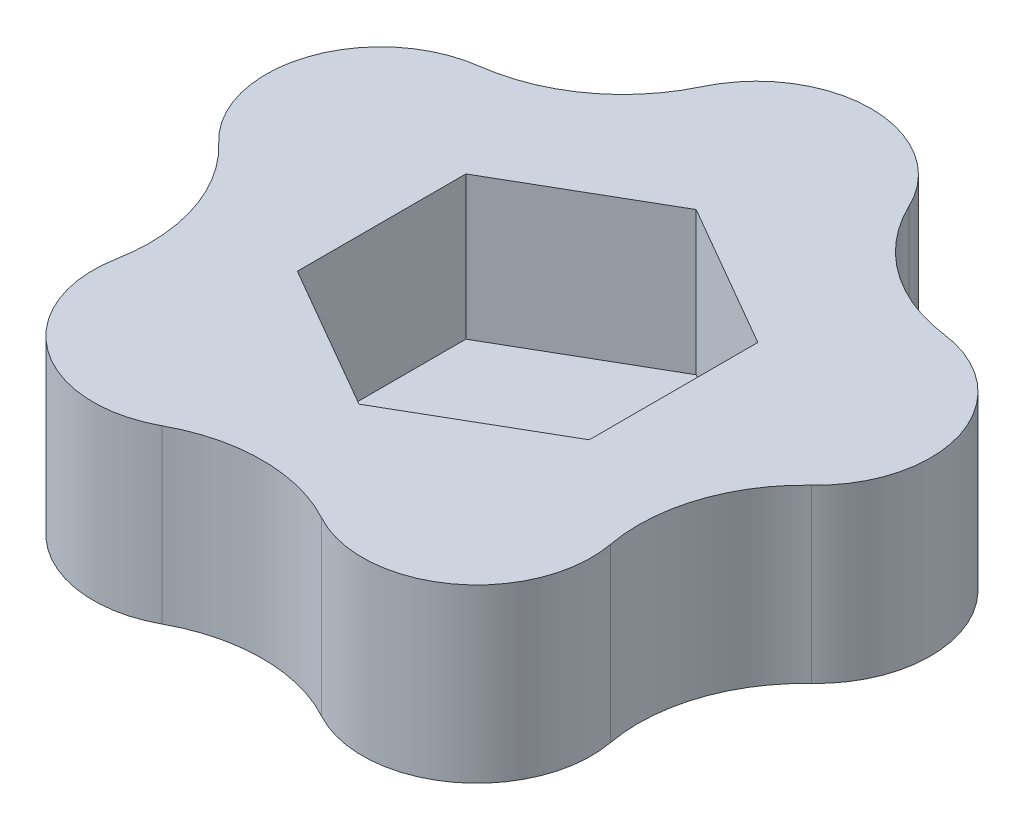
ISO-10303-21;
HEADER;
FILE_DESCRIPTION(('STEP AP214'),'2;1');
FILE_NAME('part.step','',(''),(''),'','','');
FILE_SCHEMA(('AUTOMOTIVE_DESIGN { 1 0 10303 214 1 1 1 1 }'));
ENDSEC;
DATA;
#1=APPLICATION_CONTEXT('core data for automotive mechanical design processes');
#2=APPLICATION_PROTOCOL_DEFINITION('international standard','automotive_design',2000,#1);
#3=PRODUCT_CONTEXT('',#1,'mechanical');
#4=PRODUCT('Part','Part','',(#3));
#5=PRODUCT_RELATED_PRODUCT_CATEGORY('part','',(#4));
#6=PRODUCT_DEFINITION_FORMATION('','',#4);
#7=PRODUCT_DEFINITION_CONTEXT('part definition',#1,'design');
#8=PRODUCT_DEFINITION('design','',#6,#7);
#9=PRODUCT_DEFINITION_SHAPE('','',#8);
#10=(LENGTH_UNIT() NAMED_UNIT(*) SI_UNIT(.MILLI.,.METRE.));
#11=(NAMED_UNIT(*) PLANE_ANGLE_UNIT() SI_UNIT($,.RADIAN.));
#12=(NAMED_UNIT(*) SI_UNIT($,.STERADIAN.) SOLID_ANGLE_UNIT());
#13=UNCERTAINTY_MEASURE_WITH_UNIT(LENGTH_MEASURE(1.E-05),#10,'distance_accuracy_value','');
#14=(GEOMETRIC_REPRESENTATION_CONTEXT(3) GLOBAL_UNCERTAINTY_ASSIGNED_CONTEXT((#13)) GLOBAL_UNIT_ASSIGNED_CONTEXT((#10,
#11,#12)) REPRESENTATION_CONTEXT('',''));
#15=CARTESIAN_POINT('',(0.,0.,0.));
#16=DIRECTION('',(0.,0.,1.));
#17=DIRECTION('',(1.,0.,0.));
#18=AXIS2_PLACEMENT_3D('',#15,#16,#17);
#19=CARTESIAN_POINT('',(8.86859858896919,6.,-12.2065787577734));
#20=DIRECTION('',(0.,-1.,0.));
#21=DIRECTION('',(0.,0.,-1.));
#22=AXIS2_PLACEMENT_3D('',#19,#20,#21);
#23=CYLINDRICAL_SURFACE('',#22,5.8156683816038);
#24=CARTESIAN_POINT('',(8.86859858896919,0.,-12.2065787577734));
#25=DIRECTION('',(0.,-1.,0.));
#26=DIRECTION('',(0.,0.,-1.));
#27=AXIS2_PLACEMENT_3D('',#24,#25,#26);
#28=CIRCLE('',#27,5.8156683816038);
#29=CARTESIAN_POINT('',(8.12197659333909,0.,-6.43903557887757));
#30=VERTEX_POINT('',#29);
#31=CARTESIAN_POINT('',(3.61405795069052,0.,-9.71423018554995));
#32=VERTEX_POINT('',#31);
#33=EDGE_CURVE('E155',#30,#32,#28,.T.);
#34=ORIENTED_EDGE('',*,*,#33,.T.);
#35=DIRECTION('',(0.,-1.,0.));
#36=VECTOR('',#35,1.);
#37=CARTESIAN_POINT('',(3.61405795069052,6.,-9.71423018554995));
#38=LINE('',#37,#36);
#39=CARTESIAN_POINT('',(3.61405795069052,6.,-9.71423018554995));
#40=VERTEX_POINT('',#39);
#41=EDGE_CURVE('E12',#40,#32,#38,.T.);
#42=ORIENTED_EDGE('',*,*,#41,.F.);
#43=CARTESIAN_POINT('',(8.86859858896919,6.,-12.2065787577734));
#44=DIRECTION('',(0.,-1.,0.));
#45=DIRECTION('',(0.,0.,-1.));
#46=AXIS2_PLACEMENT_3D('',#43,#44,#45);
#47=CIRCLE('',#46,5.8156683816038);
#48=CARTESIAN_POINT('',(8.12197659333909,6.,-6.43903557887757));
#49=VERTEX_POINT('',#48);
#50=EDGE_CURVE('E175',#49,#40,#47,.T.);
#51=ORIENTED_EDGE('',*,*,#50,.F.);
#52=DIRECTION('',(0.,-1.,0.));
#53=VECTOR('',#52,1.);
#54=CARTESIAN_POINT('',(8.12197659333909,6.,-6.43903557887757));
#55=LINE('',#54,#53);
#56=EDGE_CURVE('E151',#49,#30,#55,.T.);
#57=ORIENTED_EDGE('',*,*,#56,.T.);
#58=EDGE_LOOP('',(#34,#42,#51,#57));
#59=FACE_BOUND('',#58,.T.);
#60=ADVANCED_FACE('F35',(#59),#23,.F.);
#61=CARTESIAN_POINT('',(0.,6.,-8.));
#62=DIRECTION('',(0.,-1.,0.));
#63=DIRECTION('',(0.,0.,-1.));
#64=AXIS2_PLACEMENT_3D('',#61,#62,#63);
#65=CYLINDRICAL_SURFACE('',#64,4.);
#66=CARTESIAN_POINT('',(0.,0.,-8.));
#67=DIRECTION('',(0.,1.,0.));
#68=DIRECTION('',(0.,0.,-1.));
#69=AXIS2_PLACEMENT_3D('',#66,#67,#68);
#70=CIRCLE('',#69,4.);
#71=CARTESIAN_POINT('',(-3.61405795069052,0.,-9.71423018554995));
#72=VERTEX_POINT('',#71);
#73=EDGE_CURVE('E158',#32,#72,#70,.T.);
#74=ORIENTED_EDGE('',*,*,#73,.T.);
#75=DIRECTION('',(0.,-1.,0.));
#76=VECTOR('',#75,1.);
#77=CARTESIAN_POINT('',(-3.61405795069052,6.,-9.71423018554995));
#78=LINE('',#77,#76);
#79=CARTESIAN_POINT('',(-3.61405795069052,6.,-9.71423018554995));
#80=VERTEX_POINT('',#79);
#81=EDGE_CURVE('E42',#80,#72,#78,.T.);
#82=ORIENTED_EDGE('',*,*,#81,.F.);
#83=CARTESIAN_POINT('',(0.,6.,-8.));
#84=DIRECTION('',(0.,1.,0.));
#85=DIRECTION('',(0.,0.,-1.));
#86=AXIS2_PLACEMENT_3D('',#83,#84,#85);
#87=CIRCLE('',#86,4.);
#88=EDGE_CURVE('E105',#40,#80,#87,.T.);
#89=ORIENTED_EDGE('',*,*,#88,.F.);
#90=ORIENTED_EDGE('',*,*,#41,.T.);
#91=EDGE_LOOP('',(#74,#82,#89,#90));
#92=FACE_BOUND('',#91,.T.);
#93=ADVANCED_FACE('F327',(#92),#65,.T.);
#94=CARTESIAN_POINT('',(-8.86859858896919,6.,-12.2065787577734));
#95=DIRECTION('',(0.,-1.,0.));
#96=DIRECTION('',(0.,0.,-1.));
#97=AXIS2_PLACEMENT_3D('',#94,#95,#96);
#98=CYLINDRICAL_SURFACE('',#97,5.8156683816038);
#99=CARTESIAN_POINT('',(-8.86859858896919,0.,-12.2065787577734));
#100=DIRECTION('',(0.,-1.,0.));
#101=DIRECTION('',(0.,0.,-1.));
#102=AXIS2_PLACEMENT_3D('',#99,#100,#101);
#103=CIRCLE('',#102,5.8156683816038);
#104=CARTESIAN_POINT('',(-8.12197659333909,0.,-6.43903557887757));
#105=VERTEX_POINT('',#104);
#106=EDGE_CURVE('E161',#72,#105,#103,.T.);
#107=ORIENTED_EDGE('',*,*,#106,.T.);
#108=DIRECTION('',(0.,-1.,0.));
#109=VECTOR('',#108,1.);
#110=CARTESIAN_POINT('',(-8.12197659333909,6.,-6.43903557887757));
#111=LINE('',#110,#109);
#112=CARTESIAN_POINT('',(-8.12197659333909,6.,-6.43903557887757));
#113=VERTEX_POINT('',#112);
#114=EDGE_CURVE('E188',#113,#105,#111,.T.);
#115=ORIENTED_EDGE('',*,*,#114,.F.);
#116=CARTESIAN_POINT('',(-8.86859858896919,6.,-12.2065787577734));
#117=DIRECTION('',(0.,-1.,0.));
#118=DIRECTION('',(0.,0.,-1.));
#119=AXIS2_PLACEMENT_3D('',#116,#117,#118);
#120=CIRCLE('',#119,5.8156683816038);
#121=EDGE_CURVE('E196',#80,#113,#120,.T.);
#122=ORIENTED_EDGE('',*,*,#121,.F.);
#123=ORIENTED_EDGE('',*,*,#81,.T.);
#124=EDGE_LOOP('',(#107,#115,#122,#123));
#125=FACE_BOUND('',#124,.T.);
#126=ADVANCED_FACE('F194',(#125),#98,.F.);
#127=CARTESIAN_POINT('',(-7.60845213036123,6.,-2.47213595499958));
#128=DIRECTION('',(0.,-1.,0.));
#129=DIRECTION('',(0.,0.,-1.));
#130=AXIS2_PLACEMENT_3D('',#127,#128,#129);
#131=CYLINDRICAL_SURFACE('',#130,4.);
#132=CARTESIAN_POINT('',(-7.60845213036123,0.,-2.47213595499958));
#133=DIRECTION('',(0.,1.,0.));
#134=DIRECTION('',(0.,0.,-1.));
#135=AXIS2_PLACEMENT_3D('',#132,#133,#134);
#136=CIRCLE('',#135,4.);
#137=CARTESIAN_POINT('',(-10.3555872441776,0.,0.435311149667507));
#138=VERTEX_POINT('',#137);
#139=EDGE_CURVE('E163',#105,#138,#136,.T.);
#140=ORIENTED_EDGE('',*,*,#139,.T.);
#141=DIRECTION('',(0.,-1.,0.));
#142=VECTOR('',#141,1.);
#143=CARTESIAN_POINT('',(-10.3555872441776,6.,0.435311149667507));
#144=LINE('',#143,#142);
#145=CARTESIAN_POINT('',(-10.3555872441776,6.,0.435311149667507));
#146=VERTEX_POINT('',#145);
#147=EDGE_CURVE('E185',#146,#138,#144,.T.);
#148=ORIENTED_EDGE('',*,*,#147,.F.);
#149=CARTESIAN_POINT('',(-7.60845213036123,6.,-2.47213595499958));
#150=DIRECTION('',(0.,1.,0.));
#151=DIRECTION('',(0.,0.,-1.));
#152=AXIS2_PLACEMENT_3D('',#149,#150,#151);
#153=CIRCLE('',#152,4.);
#154=EDGE_CURVE('E214',#113,#146,#153,.T.);
#155=ORIENTED_EDGE('',*,*,#154,.F.);
#156=ORIENTED_EDGE('',*,*,#114,.T.);
#157=EDGE_LOOP('',(#140,#148,#155,#156));
#158=FACE_BOUND('',#157,.T.);
#159=ADVANCED_FACE('F205',(#158),#131,.T.);
#160=CARTESIAN_POINT('',(-14.3496939495315,6.,4.66249819911696));
#161=DIRECTION('',(0.,-1.,0.));
#162=DIRECTION('',(0.,0.,-1.));
#163=AXIS2_PLACEMENT_3D('',#160,#161,#162);
#164=CYLINDRICAL_SURFACE('',#163,5.8156683816038);
#165=CARTESIAN_POINT('',(-14.3496939495315,0.,4.66249819911696));
#166=DIRECTION('',(0.,-1.,0.));
#167=DIRECTION('',(0.,0.,-1.));
#168=AXIS2_PLACEMENT_3D('',#165,#166,#167);
#169=CIRCLE('',#168,5.8156683816038);
#170=CARTESIAN_POINT('',(-8.63371554120516,0.,5.73468734303375));
#171=VERTEX_POINT('',#170);
#172=EDGE_CURVE('E165',#138,#171,#169,.T.);
#173=ORIENTED_EDGE('',*,*,#172,.T.);
#174=DIRECTION('',(0.,-1.,0.));
#175=VECTOR('',#174,1.);
#176=CARTESIAN_POINT('',(-8.63371554120516,6.,5.73468734303375));
#177=LINE('',#176,#175);
#178=CARTESIAN_POINT('',(-8.63371554120516,6.,5.73468734303375));
#179=VERTEX_POINT('',#178);
#180=EDGE_CURVE('E182',#179,#171,#177,.T.);
#181=ORIENTED_EDGE('',*,*,#180,.F.);
#182=CARTESIAN_POINT('',(-14.3496939495315,6.,4.66249819911696));
#183=DIRECTION('',(0.,-1.,0.));
#184=DIRECTION('',(0.,0.,-1.));
#185=AXIS2_PLACEMENT_3D('',#182,#183,#184);
#186=CIRCLE('',#185,5.8156683816038);
#187=EDGE_CURVE('E211',#146,#179,#186,.T.);
#188=ORIENTED_EDGE('',*,*,#187,.F.);
#189=ORIENTED_EDGE('',*,*,#147,.T.);
#190=EDGE_LOOP('',(#173,#181,#188,#189));
#191=FACE_BOUND('',#190,.T.);
#192=ADVANCED_FACE('F209',(#191),#164,.F.);
#193=CARTESIAN_POINT('',(-4.70228201833979,6.,6.47213595499958));
#194=DIRECTION('',(0.,-1.,0.));
#195=DIRECTION('',(0.,0.,-1.));
#196=AXIS2_PLACEMENT_3D('',#193,#194,#195);
#197=CYLINDRICAL_SURFACE('',#196,4.);
#198=CARTESIAN_POINT('',(-4.70228201833979,0.,6.47213595499958));
#199=DIRECTION('',(0.,1.,0.));
#200=DIRECTION('',(0.,0.,-1.));
#201=AXIS2_PLACEMENT_3D('',#198,#199,#200);
#202=CIRCLE('',#201,4.);
#203=CARTESIAN_POINT('',(-2.7860469396761,0.,9.98326727172626));
#204=VERTEX_POINT('',#203);
#205=EDGE_CURVE('E167',#171,#204,#202,.T.);
#206=ORIENTED_EDGE('',*,*,#205,.T.);
#207=DIRECTION('',(0.,-1.,0.));
#208=VECTOR('',#207,1.);
#209=CARTESIAN_POINT('',(-2.7860469396761,6.,9.98326727172626));
#210=LINE('',#209,#208);
#211=CARTESIAN_POINT('',(-2.7860469396761,6.,9.98326727172626));
#212=VERTEX_POINT('',#211);
#213=EDGE_CURVE('E179',#212,#204,#210,.T.);
#214=ORIENTED_EDGE('',*,*,#213,.F.);
#215=CARTESIAN_POINT('',(-4.70228201833979,6.,6.47213595499958));
#216=DIRECTION('',(0.,1.,0.));
#217=DIRECTION('',(0.,0.,-1.));
#218=AXIS2_PLACEMENT_3D('',#215,#216,#217);
#219=CIRCLE('',#218,4.);
#220=EDGE_CURVE('E213',#179,#212,#219,.T.);
#221=ORIENTED_EDGE('',*,*,#220,.F.);
#222=ORIENTED_EDGE('',*,*,#180,.T.);
#223=EDGE_LOOP('',(#206,#214,#221,#222));
#224=FACE_BOUND('',#223,.T.);
#225=ADVANCED_FACE('F351',(#224),#197,.T.);
#226=CARTESIAN_POINT('',(0.,6.,15.0881611173128));
#227=DIRECTION('',(0.,-1.,0.));
#228=DIRECTION('',(0.,0.,-1.));
#229=AXIS2_PLACEMENT_3D('',#226,#227,#228);
#230=CYLINDRICAL_SURFACE('',#229,5.81566838160377);
#231=CARTESIAN_POINT('',(0.,0.,15.0881611173128));
#232=DIRECTION('',(0.,-1.,0.));
#233=DIRECTION('',(0.,0.,-1.));
#234=AXIS2_PLACEMENT_3D('',#231,#232,#233);
#235=CIRCLE('',#234,5.81566838160377);
#236=CARTESIAN_POINT('',(2.7860469396761,0.,9.98326727172625));
#237=VERTEX_POINT('',#236);
#238=EDGE_CURVE('E169',#204,#237,#235,.T.);
#239=ORIENTED_EDGE('',*,*,#238,.T.);
#240=DIRECTION('',(0.,-1.,0.));
#241=VECTOR('',#240,1.);
#242=CARTESIAN_POINT('',(2.7860469396761,6.,9.98326727172625));
#243=LINE('',#242,#241);
#244=CARTESIAN_POINT('',(2.7860469396761,6.,9.98326727172625));
#245=VERTEX_POINT('',#244);
#246=EDGE_CURVE('E146',#245,#237,#243,.T.);
#247=ORIENTED_EDGE('',*,*,#246,.F.);
#248=CARTESIAN_POINT('',(0.,6.,15.0881611173128));
#249=DIRECTION('',(0.,-1.,0.));
#250=DIRECTION('',(0.,0.,-1.));
#251=AXIS2_PLACEMENT_3D('',#248,#249,#250);
#252=CIRCLE('',#251,5.81566838160377);
#253=EDGE_CURVE('E134',#212,#245,#252,.T.);
#254=ORIENTED_EDGE('',*,*,#253,.F.);
#255=ORIENTED_EDGE('',*,*,#213,.T.);
#256=EDGE_LOOP('',(#239,#247,#254,#255));
#257=FACE_BOUND('',#256,.T.);
#258=ADVANCED_FACE('F348',(#257),#230,.F.);
#259=CARTESIAN_POINT('',(4.70228201833979,6.,6.47213595499958));
#260=DIRECTION('',(0.,-1.,0.));
#261=DIRECTION('',(0.,0.,-1.));
#262=AXIS2_PLACEMENT_3D('',#259,#260,#261);
#263=CYLINDRICAL_SURFACE('',#262,4.);
#264=CARTESIAN_POINT('',(4.70228201833979,0.,6.47213595499958));
#265=DIRECTION('',(0.,1.,0.));
#266=DIRECTION('',(0.,0.,-1.));
#267=AXIS2_PLACEMENT_3D('',#264,#265,#266);
#268=CIRCLE('',#267,4.);
#269=CARTESIAN_POINT('',(8.63371554120517,0.,5.73468734303375));
#270=VERTEX_POINT('',#269);
#271=EDGE_CURVE('E143',#237,#270,#268,.T.);
#272=ORIENTED_EDGE('',*,*,#271,.T.);
#273=DIRECTION('',(0.,-1.,0.));
#274=VECTOR('',#273,1.);
#275=CARTESIAN_POINT('',(8.63371554120517,6.,5.73468734303375));
#276=LINE('',#275,#274);
#277=CARTESIAN_POINT('',(8.63371554120517,6.,5.73468734303375));
#278=VERTEX_POINT('',#277);
#279=EDGE_CURVE('E140',#278,#270,#276,.T.);
#280=ORIENTED_EDGE('',*,*,#279,.F.);
#281=CARTESIAN_POINT('',(4.70228201833979,6.,6.47213595499958));
#282=DIRECTION('',(0.,1.,0.));
#283=DIRECTION('',(0.,0.,-1.));
#284=AXIS2_PLACEMENT_3D('',#281,#282,#283);
#285=CIRCLE('',#284,4.);
#286=EDGE_CURVE('E127',#245,#278,#285,.T.);
#287=ORIENTED_EDGE('',*,*,#286,.F.);
#288=ORIENTED_EDGE('',*,*,#246,.T.);
#289=EDGE_LOOP('',(#272,#280,#287,#288));
#290=FACE_BOUND('',#289,.T.);
#291=ADVANCED_FACE('F141',(#290),#263,.T.);
#292=CARTESIAN_POINT('',(14.3496939495315,6.,4.66249819911694));
#293=DIRECTION('',(0.,-1.,0.));
#294=DIRECTION('',(0.,0.,-1.));
#295=AXIS2_PLACEMENT_3D('',#292,#293,#294);
#296=CYLINDRICAL_SURFACE('',#295,5.81566838160377);
#297=CARTESIAN_POINT('',(14.3496939495315,0.,4.66249819911694));
#298=DIRECTION('',(0.,-1.,0.));
#299=DIRECTION('',(0.,0.,-1.));
#300=AXIS2_PLACEMENT_3D('',#297,#298,#299);
#301=CIRCLE('',#300,5.81566838160377);
#302=CARTESIAN_POINT('',(10.3555872441776,0.,0.435311149667493));
#303=VERTEX_POINT('',#302);
#304=EDGE_CURVE('E172',#270,#303,#301,.T.);
#305=ORIENTED_EDGE('',*,*,#304,.T.);
#306=DIRECTION('',(0.,-1.,0.));
#307=VECTOR('',#306,1.);
#308=CARTESIAN_POINT('',(10.3555872441776,6.,0.435311149667493));
#309=LINE('',#308,#307);
#310=CARTESIAN_POINT('',(10.3555872441776,6.,0.435311149667493));
#311=VERTEX_POINT('',#310);
#312=EDGE_CURVE('E147',#311,#303,#309,.T.);
#313=ORIENTED_EDGE('',*,*,#312,.F.);
#314=CARTESIAN_POINT('',(14.3496939495315,6.,4.66249819911694));
#315=DIRECTION('',(0.,-1.,0.));
#316=DIRECTION('',(0.,0.,-1.));
#317=AXIS2_PLACEMENT_3D('',#314,#315,#316);
#318=CIRCLE('',#317,5.81566838160377);
#319=EDGE_CURVE('E131',#278,#311,#318,.T.);
#320=ORIENTED_EDGE('',*,*,#319,.F.);
#321=ORIENTED_EDGE('',*,*,#279,.T.);
#322=EDGE_LOOP('',(#305,#313,#320,#321));
#323=FACE_BOUND('',#322,.T.);
#324=ADVANCED_FACE('F149',(#323),#296,.F.);
#325=CARTESIAN_POINT('',(7.60845213036123,6.,-2.47213595499958));
#326=DIRECTION('',(0.,-1.,0.));
#327=DIRECTION('',(0.,0.,-1.));
#328=AXIS2_PLACEMENT_3D('',#325,#326,#327);
#329=CYLINDRICAL_SURFACE('',#328,4.);
#330=CARTESIAN_POINT('',(7.60845213036123,0.,-2.47213595499958));
#331=DIRECTION('',(0.,1.,0.));
#332=DIRECTION('',(0.,0.,-1.));
#333=AXIS2_PLACEMENT_3D('',#330,#331,#332);
#334=CIRCLE('',#333,4.);
#335=EDGE_CURVE('E97',#303,#30,#334,.T.);
#336=ORIENTED_EDGE('',*,*,#335,.T.);
#337=ORIENTED_EDGE('',*,*,#56,.F.);
#338=CARTESIAN_POINT('',(7.60845213036123,6.,-2.47213595499958));
#339=DIRECTION('',(0.,1.,0.));
#340=DIRECTION('',(0.,0.,-1.));
#341=AXIS2_PLACEMENT_3D('',#338,#339,#340);
#342=CIRCLE('',#341,4.);
#343=EDGE_CURVE('E58',#311,#49,#342,.T.);
#344=ORIENTED_EDGE('',*,*,#343,.F.);
#345=ORIENTED_EDGE('',*,*,#312,.T.);
#346=EDGE_LOOP('',(#336,#337,#344,#345));
#347=FACE_BOUND('',#346,.T.);
#348=ADVANCED_FACE('F335',(#347),#329,.T.);
#349=CARTESIAN_POINT('',(4.4342992944846,6.,-10.1032893788867));
#350=DIRECTION('',(0.,-1.,0.));
#351=DIRECTION('',(0.,0.,-1.));
#352=AXIS2_PLACEMENT_3D('',#349,#350,#351);
#353=PLANE('',#352);
#354=DIRECTION('',(0.866025403784442,0.,0.499999999999995));
#355=VECTOR('',#354,1.);
#356=CARTESIAN_POINT('',(-5.09999999999999,6.,2.94448637286712));
#357=LINE('',#356,#355);
#358=CARTESIAN_POINT('',(-5.09999999999999,6.,2.94448637286712));
#359=VERTEX_POINT('',#358);
#360=CARTESIAN_POINT('',(0.,6.,5.88897274573419));
#361=VERTEX_POINT('',#360);
#362=EDGE_CURVE('E261',#359,#361,#357,.T.);
#363=ORIENTED_EDGE('',*,*,#362,.F.);
#364=DIRECTION('',(0.,0.,1.));
#365=VECTOR('',#364,1.);
#366=CARTESIAN_POINT('',(-5.10000000000001,6.,-2.94448637286708));
#367=LINE('',#366,#365);
#368=CARTESIAN_POINT('',(-5.10000000000001,6.,-2.94448637286708));
#369=VERTEX_POINT('',#368);
#370=EDGE_CURVE('E258',#369,#359,#367,.T.);
#371=ORIENTED_EDGE('',*,*,#370,.F.);
#372=DIRECTION('',(-0.866025403784438,0.,0.500000000000001));
#373=VECTOR('',#372,1.);
#374=CARTESIAN_POINT('',(0.,6.,-5.88897274573419));
#375=LINE('',#374,#373);
#376=CARTESIAN_POINT('',(0.,6.,-5.88897274573419));
#377=VERTEX_POINT('',#376);
#378=EDGE_CURVE('E255',#377,#369,#375,.T.);
#379=ORIENTED_EDGE('',*,*,#378,.F.);
#380=DIRECTION('',(-0.866025403784442,0.,-0.499999999999995));
#381=VECTOR('',#380,1.);
#382=CARTESIAN_POINT('',(5.09999999999997,6.,-2.94448637286715));
#383=LINE('',#382,#381);
#384=CARTESIAN_POINT('',(5.09999999999997,6.,-2.94448637286715));
#385=VERTEX_POINT('',#384);
#386=EDGE_CURVE('E49',#385,#377,#383,.T.);
#387=ORIENTED_EDGE('',*,*,#386,.F.);
#388=DIRECTION('',(0.,0.,-1.));
#389=VECTOR('',#388,1.);
#390=CARTESIAN_POINT('',(5.10000000000003,6.,2.94448637286705));
#391=LINE('',#390,#389);
#392=CARTESIAN_POINT('',(5.10000000000003,6.,2.94448637286705));
#393=VERTEX_POINT('',#392);
#394=EDGE_CURVE('E267',#393,#385,#391,.T.);
#395=ORIENTED_EDGE('',*,*,#394,.F.);
#396=DIRECTION('',(0.866025403784435,0.,-0.500000000000007));
#397=VECTOR('',#396,1.);
#398=CARTESIAN_POINT('',(0.,6.,5.88897274573419));
#399=LINE('',#398,#397);
#400=EDGE_CURVE('E264',#361,#393,#399,.T.);
#401=ORIENTED_EDGE('',*,*,#400,.F.);
#402=EDGE_LOOP('',(#363,#371,#379,#387,#395,#401));
#403=FACE_BOUND('',#402,.T.);
#404=ORIENTED_EDGE('',*,*,#50,.T.);
#405=ORIENTED_EDGE('',*,*,#88,.T.);
#406=ORIENTED_EDGE('',*,*,#121,.T.);
#407=ORIENTED_EDGE('',*,*,#154,.T.);
#408=ORIENTED_EDGE('',*,*,#187,.T.);
#409=ORIENTED_EDGE('',*,*,#220,.T.);
#410=ORIENTED_EDGE('',*,*,#253,.T.);
#411=ORIENTED_EDGE('',*,*,#286,.T.);
#412=ORIENTED_EDGE('',*,*,#319,.T.);
#413=ORIENTED_EDGE('',*,*,#343,.T.);
#414=EDGE_LOOP('',(#404,#405,#406,#407,#408,#409,#410,#411,#412,#413));
#415=FACE_BOUND('',#414,.T.);
#416=ADVANCED_FACE('F129',(#403,#415),#353,.F.);
#417=CARTESIAN_POINT('',(4.4342992944846,0.,-10.1032893788867));
#418=DIRECTION('',(0.,-1.,0.));
#419=DIRECTION('',(0.,0.,-1.));
#420=AXIS2_PLACEMENT_3D('',#417,#418,#419);
#421=PLANE('',#420);
#422=ORIENTED_EDGE('',*,*,#33,.F.);
#423=ORIENTED_EDGE('',*,*,#335,.F.);
#424=ORIENTED_EDGE('',*,*,#304,.F.);
#425=ORIENTED_EDGE('',*,*,#271,.F.);
#426=ORIENTED_EDGE('',*,*,#238,.F.);
#427=ORIENTED_EDGE('',*,*,#205,.F.);
#428=ORIENTED_EDGE('',*,*,#172,.F.);
#429=ORIENTED_EDGE('',*,*,#139,.F.);
#430=ORIENTED_EDGE('',*,*,#106,.F.);
#431=ORIENTED_EDGE('',*,*,#73,.F.);
#432=EDGE_LOOP('',(#422,#423,#424,#425,#426,#427,#428,#429,#430,#431));
#433=FACE_BOUND('',#432,.T.);
#434=ADVANCED_FACE('F200',(#433),#421,.T.);
#435=CARTESIAN_POINT('',(4.4342992944846,1.,-10.1032893788867));
#436=DIRECTION('',(0.,-1.,0.));
#437=DIRECTION('',(0.,0.,-1.));
#438=AXIS2_PLACEMENT_3D('',#435,#436,#437);
#439=PLANE('',#438);
#440=DIRECTION('',(-0.866025403784438,0.,0.500000000000001));
#441=VECTOR('',#440,1.);
#442=CARTESIAN_POINT('',(0.,0.999999999999999,-5.88897274573419));
#443=LINE('',#442,#441);
#444=CARTESIAN_POINT('',(0.,0.999999999999999,-5.88897274573419));
#445=VERTEX_POINT('',#444);
#446=CARTESIAN_POINT('',(-5.10000000000001,0.999999999999999,-2.94448637286708));
#447=VERTEX_POINT('',#446);
#448=EDGE_CURVE('E224',#445,#447,#443,.T.);
#449=ORIENTED_EDGE('',*,*,#448,.T.);
#450=DIRECTION('',(0.,0.,1.));
#451=VECTOR('',#450,1.);
#452=CARTESIAN_POINT('',(-5.10000000000001,0.999999999999999,-2.94448637286708));
#453=LINE('',#452,#451);
#454=CARTESIAN_POINT('',(-5.09999999999999,0.999999999999999,2.94448637286712));
#455=VERTEX_POINT('',#454);
#456=EDGE_CURVE('E229',#447,#455,#453,.T.);
#457=ORIENTED_EDGE('',*,*,#456,.T.);
#458=DIRECTION('',(0.866025403784441,0.,0.499999999999995));
#459=VECTOR('',#458,1.);
#460=CARTESIAN_POINT('',(-5.09999999999999,0.999999999999999,2.94448637286712));
#461=LINE('',#460,#459);
#462=CARTESIAN_POINT('',(0.,0.999999999999999,5.88897274573419));
#463=VERTEX_POINT('',#462);
#464=EDGE_CURVE('E228',#455,#463,#461,.T.);
#465=ORIENTED_EDGE('',*,*,#464,.T.);
#466=DIRECTION('',(0.866025403784435,0.,-0.500000000000007));
#467=VECTOR('',#466,1.);
#468=CARTESIAN_POINT('',(0.,0.999999999999999,5.88897274573419));
#469=LINE('',#468,#467);
#470=CARTESIAN_POINT('',(5.10000000000003,0.999999999999999,2.94448637286705));
#471=VERTEX_POINT('',#470);
#472=EDGE_CURVE('E233',#463,#471,#469,.T.);
#473=ORIENTED_EDGE('',*,*,#472,.T.);
#474=DIRECTION('',(0.,0.,-1.));
#475=VECTOR('',#474,1.);
#476=CARTESIAN_POINT('',(5.10000000000003,0.999999999999999,2.94448637286705));
#477=LINE('',#476,#475);
#478=CARTESIAN_POINT('',(5.09999999999997,0.999999999999999,-2.94448637286715));
#479=VERTEX_POINT('',#478);
#480=EDGE_CURVE('E237',#471,#479,#477,.T.);
#481=ORIENTED_EDGE('',*,*,#480,.T.);
#482=DIRECTION('',(-0.866025403784442,0.,-0.499999999999995));
#483=VECTOR('',#482,1.);
#484=CARTESIAN_POINT('',(5.09999999999997,0.999999999999999,-2.94448637286715));
#485=LINE('',#484,#483);
#486=EDGE_CURVE('E240',#479,#445,#485,.T.);
#487=ORIENTED_EDGE('',*,*,#486,.T.);
#488=EDGE_LOOP('',(#449,#457,#465,#473,#481,#487));
#489=FACE_BOUND('',#488,.T.);
#490=ADVANCED_FACE('F316',(#489),#439,.F.);
#491=CARTESIAN_POINT('',(-5.10000000000001,-15.5807573628499,-2.94448637286708));
#492=DIRECTION('',(-1.,0.,0.));
#493=DIRECTION('',(0.,0.,1.));
#494=AXIS2_PLACEMENT_3D('',#491,#492,#493);
#495=PLANE('',#494);
#496=DIRECTION('',(0.,1.,0.));
#497=VECTOR('',#496,1.);
#498=CARTESIAN_POINT('',(-5.10000000000001,-15.5807573628499,-2.94448637286708));
#499=LINE('',#498,#497);
#500=EDGE_CURVE('E159',#447,#369,#499,.T.);
#501=ORIENTED_EDGE('',*,*,#500,.T.);
#502=ORIENTED_EDGE('',*,*,#370,.T.);
#503=DIRECTION('',(0.,1.,0.));
#504=VECTOR('',#503,1.);
#505=CARTESIAN_POINT('',(-5.09999999999999,-15.5807573628499,2.94448637286712));
#506=LINE('',#505,#504);
#507=EDGE_CURVE('E225',#455,#359,#506,.T.);
#508=ORIENTED_EDGE('',*,*,#507,.F.);
#509=ORIENTED_EDGE('',*,*,#456,.F.);
#510=EDGE_LOOP('',(#501,#502,#508,#509));
#511=FACE_BOUND('',#510,.T.);
#512=ADVANCED_FACE('F313',(#511),#495,.F.);
#513=CARTESIAN_POINT('',(-5.09999999999999,-15.5807573628499,2.94448637286712));
#514=DIRECTION('',(-0.499999999999995,0.,0.866025403784442));
#515=DIRECTION('',(0.866025403784441,0.,0.499999999999995));
#516=AXIS2_PLACEMENT_3D('',#513,#514,#515);
#517=PLANE('',#516);
#518=ORIENTED_EDGE('',*,*,#507,.T.);
#519=ORIENTED_EDGE('',*,*,#362,.T.);
#520=DIRECTION('',(0.,1.,0.));
#521=VECTOR('',#520,1.);
#522=CARTESIAN_POINT('',(0.,-15.5807573628499,5.88897274573419));
#523=LINE('',#522,#521);
#524=EDGE_CURVE('E230',#463,#361,#523,.T.);
#525=ORIENTED_EDGE('',*,*,#524,.F.);
#526=ORIENTED_EDGE('',*,*,#464,.F.);
#527=EDGE_LOOP('',(#518,#519,#525,#526));
#528=FACE_BOUND('',#527,.T.);
#529=ADVANCED_FACE('F312',(#528),#517,.F.);
#530=CARTESIAN_POINT('',(0.,-15.5807573628499,5.88897274573419));
#531=DIRECTION('',(0.500000000000007,0.,0.866025403784435));
#532=DIRECTION('',(0.866025403784435,0.,-0.500000000000007));
#533=AXIS2_PLACEMENT_3D('',#530,#531,#532);
#534=PLANE('',#533);
#535=ORIENTED_EDGE('',*,*,#524,.T.);
#536=ORIENTED_EDGE('',*,*,#400,.T.);
#537=DIRECTION('',(0.,1.,0.));
#538=VECTOR('',#537,1.);
#539=CARTESIAN_POINT('',(5.10000000000003,-15.5807573628499,2.94448637286705));
#540=LINE('',#539,#538);
#541=EDGE_CURVE('E234',#471,#393,#540,.T.);
#542=ORIENTED_EDGE('',*,*,#541,.F.);
#543=ORIENTED_EDGE('',*,*,#472,.F.);
#544=EDGE_LOOP('',(#535,#536,#542,#543));
#545=FACE_BOUND('',#544,.T.);
#546=ADVANCED_FACE('F314',(#545),#534,.F.);
#547=CARTESIAN_POINT('',(5.10000000000003,-15.5807573628499,2.94448637286705));
#548=DIRECTION('',(1.,0.,0.));
#549=DIRECTION('',(0.,0.,-1.));
#550=AXIS2_PLACEMENT_3D('',#547,#548,#549);
#551=PLANE('',#550);
#552=ORIENTED_EDGE('',*,*,#541,.T.);
#553=ORIENTED_EDGE('',*,*,#394,.T.);
#554=DIRECTION('',(0.,1.,0.));
#555=VECTOR('',#554,1.);
#556=CARTESIAN_POINT('',(5.09999999999997,-15.5807573628499,-2.94448637286715));
#557=LINE('',#556,#555);
#558=EDGE_CURVE('E238',#479,#385,#557,.T.);
#559=ORIENTED_EDGE('',*,*,#558,.F.);
#560=ORIENTED_EDGE('',*,*,#480,.F.);
#561=EDGE_LOOP('',(#552,#553,#559,#560));
#562=FACE_BOUND('',#561,.T.);
#563=ADVANCED_FACE('F274',(#562),#551,.F.);
#564=CARTESIAN_POINT('',(5.09999999999997,-15.5807573628499,-2.94448637286715));
#565=DIRECTION('',(0.499999999999995,0.,-0.866025403784442));
#566=DIRECTION('',(-0.866025403784442,0.,-0.499999999999995));
#567=AXIS2_PLACEMENT_3D('',#564,#565,#566);
#568=PLANE('',#567);
#569=ORIENTED_EDGE('',*,*,#558,.T.);
#570=ORIENTED_EDGE('',*,*,#386,.T.);
#571=DIRECTION('',(0.,1.,0.));
#572=VECTOR('',#571,1.);
#573=CARTESIAN_POINT('',(0.,-15.5807573628499,-5.88897274573419));
#574=LINE('',#573,#572);
#575=EDGE_CURVE('E241',#445,#377,#574,.T.);
#576=ORIENTED_EDGE('',*,*,#575,.F.);
#577=ORIENTED_EDGE('',*,*,#486,.F.);
#578=EDGE_LOOP('',(#569,#570,#576,#577));
#579=FACE_BOUND('',#578,.T.);
#580=ADVANCED_FACE('F317',(#579),#568,.F.);
#581=CARTESIAN_POINT('',(0.,-15.5807573628499,-5.88897274573419));
#582=DIRECTION('',(-0.500000000000001,0.,-0.866025403784438));
#583=DIRECTION('',(-0.866025403784438,0.,0.500000000000001));
#584=AXIS2_PLACEMENT_3D('',#581,#582,#583);
#585=PLANE('',#584);
#586=ORIENTED_EDGE('',*,*,#575,.T.);
#587=ORIENTED_EDGE('',*,*,#378,.T.);
#588=ORIENTED_EDGE('',*,*,#500,.F.);
#589=ORIENTED_EDGE('',*,*,#448,.F.);
#590=EDGE_LOOP('',(#586,#587,#588,#589));
#591=FACE_BOUND('',#590,.T.);
#592=ADVANCED_FACE('F287',(#591),#585,.F.);
#593=CLOSED_SHELL('',(#60,#93,#126,#159,#192,#225,#258,#291,#324,#348,#416,#434,#490,#512,#529,
#546,#563,#580,#592));
#594=MANIFOLD_SOLID_BREP('B2',#593);
#595=ADVANCED_BREP_SHAPE_REPRESENTATION('',(#18,#594),#14);
#596=SHAPE_DEFINITION_REPRESENTATION(#9,#595);
ENDSEC;
END-ISO-10303-21;
